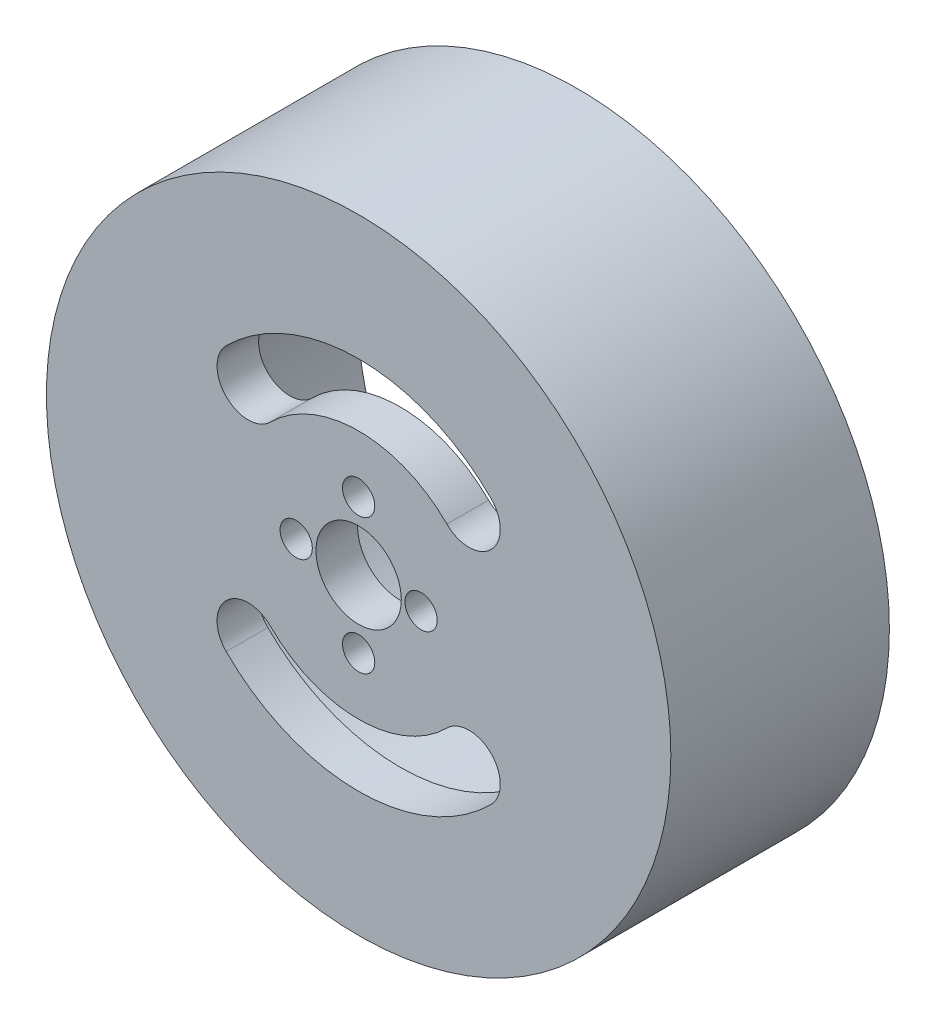
ISO-10303-21;
HEADER;
FILE_DESCRIPTION(('STEP AP214'),'2;1');
FILE_NAME('part.step','',(''),(''),'','','');
FILE_SCHEMA(('AUTOMOTIVE_DESIGN { 1 0 10303 214 1 1 1 1 }'));
ENDSEC;
DATA;
#1=APPLICATION_CONTEXT('core data for automotive mechanical design processes');
#2=APPLICATION_PROTOCOL_DEFINITION('international standard','automotive_design',2000,#1);
#3=PRODUCT_CONTEXT('',#1,'mechanical');
#4=PRODUCT('Part','Part','',(#3));
#5=PRODUCT_RELATED_PRODUCT_CATEGORY('part','',(#4));
#6=PRODUCT_DEFINITION_FORMATION('','',#4);
#7=PRODUCT_DEFINITION_CONTEXT('part definition',#1,'design');
#8=PRODUCT_DEFINITION('design','',#6,#7);
#9=PRODUCT_DEFINITION_SHAPE('','',#8);
#10=(LENGTH_UNIT() NAMED_UNIT(*) SI_UNIT(.MILLI.,.METRE.));
#11=(NAMED_UNIT(*) PLANE_ANGLE_UNIT() SI_UNIT($,.RADIAN.));
#12=(NAMED_UNIT(*) SI_UNIT($,.STERADIAN.) SOLID_ANGLE_UNIT());
#13=UNCERTAINTY_MEASURE_WITH_UNIT(LENGTH_MEASURE(1.E-05),#10,'distance_accuracy_value','');
#14=(GEOMETRIC_REPRESENTATION_CONTEXT(3) GLOBAL_UNCERTAINTY_ASSIGNED_CONTEXT((#13)) GLOBAL_UNIT_ASSIGNED_CONTEXT((#10,
#11,#12)) REPRESENTATION_CONTEXT('',''));
#15=CARTESIAN_POINT('',(0.,0.,0.));
#16=DIRECTION('',(0.,0.,1.));
#17=DIRECTION('',(1.,0.,0.));
#18=AXIS2_PLACEMENT_3D('',#15,#16,#17);
#19=CARTESIAN_POINT('',(0.,0.,-4.));
#20=DIRECTION('',(0.,0.,1.));
#21=DIRECTION('',(1.,0.,0.));
#22=AXIS2_PLACEMENT_3D('',#19,#20,#21);
#23=PLANE('',#22);
#24=CARTESIAN_POINT('',(0.,-6.5,-4.));
#25=DIRECTION('',(0.,0.,1.));
#26=DIRECTION('',(1.,0.,0.));
#27=AXIS2_PLACEMENT_3D('',#24,#25,#26);
#28=CIRCLE('',#27,1.55);
#29=CARTESIAN_POINT('',(1.55,-6.5,-4.));
#30=VERTEX_POINT('',#29);
#31=EDGE_CURVE('E177',#30,#30,#28,.T.);
#32=ORIENTED_EDGE('',*,*,#31,.T.);
#33=EDGE_LOOP('',(#32));
#34=FACE_BOUND('',#33,.T.);
#35=CARTESIAN_POINT('',(0.,0.,-4.));
#36=DIRECTION('',(0.,0.,-1.));
#37=DIRECTION('',(1.,0.,0.));
#38=AXIS2_PLACEMENT_3D('',#35,#36,#37);
#39=CIRCLE('',#38,12.);
#40=CARTESIAN_POINT('',(-8.48528137423847,8.48528137423867,-4.));
#41=VERTEX_POINT('',#40);
#42=CARTESIAN_POINT('',(8.48528137423846,8.48528137423867,-4.));
#43=VERTEX_POINT('',#42);
#44=EDGE_CURVE('E152',#41,#43,#39,.T.);
#45=ORIENTED_EDGE('',*,*,#44,.T.);
#46=CARTESIAN_POINT('',(10.6066017177981,10.6066017177983,-4.));
#47=DIRECTION('',(0.,0.,1.));
#48=DIRECTION('',(1.,0.,0.));
#49=AXIS2_PLACEMENT_3D('',#46,#47,#48);
#50=CIRCLE('',#49,3.);
#51=CARTESIAN_POINT('',(12.7279220613577,12.727922061358,-4.));
#52=VERTEX_POINT('',#51);
#53=EDGE_CURVE('E155',#43,#52,#50,.T.);
#54=ORIENTED_EDGE('',*,*,#53,.T.);
#55=CARTESIAN_POINT('',(0.,0.,-4.));
#56=DIRECTION('',(0.,0.,1.));
#57=DIRECTION('',(1.,0.,0.));
#58=AXIS2_PLACEMENT_3D('',#55,#56,#57);
#59=CIRCLE('',#58,18.);
#60=CARTESIAN_POINT('',(-12.7279220613577,12.727922061358,-4.));
#61=VERTEX_POINT('',#60);
#62=EDGE_CURVE('E145',#52,#61,#59,.T.);
#63=ORIENTED_EDGE('',*,*,#62,.T.);
#64=CARTESIAN_POINT('',(-10.6066017177981,10.6066017177983,-4.));
#65=DIRECTION('',(0.,0.,1.));
#66=DIRECTION('',(1.,0.,0.));
#67=AXIS2_PLACEMENT_3D('',#64,#65,#66);
#68=CIRCLE('',#67,3.);
#69=EDGE_CURVE('E148',#61,#41,#68,.T.);
#70=ORIENTED_EDGE('',*,*,#69,.T.);
#71=EDGE_LOOP('',(#45,#54,#63,#70));
#72=FACE_BOUND('',#71,.T.);
#73=CARTESIAN_POINT('',(6.,0.,-4.));
#74=DIRECTION('',(0.,0.,1.));
#75=DIRECTION('',(1.,0.,0.));
#76=AXIS2_PLACEMENT_3D('',#73,#74,#75);
#77=CIRCLE('',#76,1.55);
#78=CARTESIAN_POINT('',(7.55,0.,-4.));
#79=VERTEX_POINT('',#78);
#80=EDGE_CURVE('E139',#79,#79,#77,.T.);
#81=ORIENTED_EDGE('',*,*,#80,.T.);
#82=EDGE_LOOP('',(#81));
#83=FACE_BOUND('',#82,.T.);
#84=CARTESIAN_POINT('',(-10.6066017177981,-10.6066017177983,-4.));
#85=DIRECTION('',(0.,0.,1.));
#86=DIRECTION('',(1.,0.,0.));
#87=AXIS2_PLACEMENT_3D('',#84,#85,#86);
#88=CIRCLE('',#87,3.);
#89=CARTESIAN_POINT('',(-8.48528137423847,-8.48528137423867,-4.));
#90=VERTEX_POINT('',#89);
#91=CARTESIAN_POINT('',(-12.7279220613577,-12.727922061358,-4.));
#92=VERTEX_POINT('',#91);
#93=EDGE_CURVE('E110',#90,#92,#88,.T.);
#94=ORIENTED_EDGE('',*,*,#93,.T.);
#95=CARTESIAN_POINT('',(0.,0.,-4.));
#96=DIRECTION('',(0.,0.,1.));
#97=DIRECTION('',(1.,0.,0.));
#98=AXIS2_PLACEMENT_3D('',#95,#96,#97);
#99=CIRCLE('',#98,18.);
#100=CARTESIAN_POINT('',(12.7279220613577,-12.727922061358,-4.));
#101=VERTEX_POINT('',#100);
#102=EDGE_CURVE('E115',#92,#101,#99,.T.);
#103=ORIENTED_EDGE('',*,*,#102,.T.);
#104=CARTESIAN_POINT('',(10.6066017177981,-10.6066017177983,-4.));
#105=DIRECTION('',(0.,0.,1.));
#106=DIRECTION('',(1.,0.,0.));
#107=AXIS2_PLACEMENT_3D('',#104,#105,#106);
#108=CIRCLE('',#107,3.);
#109=CARTESIAN_POINT('',(8.48528137423847,-8.48528137423867,-4.));
#110=VERTEX_POINT('',#109);
#111=EDGE_CURVE('E120',#101,#110,#108,.T.);
#112=ORIENTED_EDGE('',*,*,#111,.T.);
#113=CARTESIAN_POINT('',(0.,0.,-4.));
#114=DIRECTION('',(0.,0.,-1.));
#115=DIRECTION('',(1.,0.,0.));
#116=AXIS2_PLACEMENT_3D('',#113,#114,#115);
#117=CIRCLE('',#116,12.);
#118=EDGE_CURVE('E50',#110,#90,#117,.T.);
#119=ORIENTED_EDGE('',*,*,#118,.T.);
#120=EDGE_LOOP('',(#94,#103,#112,#119));
#121=FACE_BOUND('',#120,.T.);
#122=CARTESIAN_POINT('',(-6.,0.,-4.));
#123=DIRECTION('',(0.,0.,1.));
#124=DIRECTION('',(1.,0.,0.));
#125=AXIS2_PLACEMENT_3D('',#122,#123,#124);
#126=CIRCLE('',#125,1.55);
#127=CARTESIAN_POINT('',(-4.45,0.,-4.));
#128=VERTEX_POINT('',#127);
#129=EDGE_CURVE('E129',#128,#128,#126,.T.);
#130=ORIENTED_EDGE('',*,*,#129,.T.);
#131=EDGE_LOOP('',(#130));
#132=FACE_BOUND('',#131,.T.);
#133=CARTESIAN_POINT('',(0.,6.5,-4.));
#134=DIRECTION('',(0.,0.,1.));
#135=DIRECTION('',(1.,0.,0.));
#136=AXIS2_PLACEMENT_3D('',#133,#134,#135);
#137=CIRCLE('',#136,1.55);
#138=CARTESIAN_POINT('',(1.55,6.5,-4.));
#139=VERTEX_POINT('',#138);
#140=EDGE_CURVE('E204',#139,#139,#137,.T.);
#141=ORIENTED_EDGE('',*,*,#140,.T.);
#142=EDGE_LOOP('',(#141));
#143=FACE_BOUND('',#142,.T.);
#144=CARTESIAN_POINT('',(0.,0.,-4.));
#145=DIRECTION('',(0.,0.,1.));
#146=DIRECTION('',(1.,0.,0.));
#147=AXIS2_PLACEMENT_3D('',#144,#145,#146);
#148=CIRCLE('',#147,4.1);
#149=CARTESIAN_POINT('',(4.1,0.,-4.));
#150=VERTEX_POINT('',#149);
#151=EDGE_CURVE('E196',#150,#150,#148,.T.);
#152=ORIENTED_EDGE('',*,*,#151,.T.);
#153=EDGE_LOOP('',(#152));
#154=FACE_BOUND('',#153,.T.);
#155=CARTESIAN_POINT('',(0.,0.,-4.));
#156=DIRECTION('',(0.,0.,1.));
#157=DIRECTION('',(1.,0.,0.));
#158=AXIS2_PLACEMENT_3D('',#155,#156,#157);
#159=CIRCLE('',#158,21.);
#160=CARTESIAN_POINT('',(21.,0.,-4.));
#161=VERTEX_POINT('',#160);
#162=EDGE_CURVE('E11',#161,#161,#159,.T.);
#163=ORIENTED_EDGE('',*,*,#162,.F.);
#164=EDGE_LOOP('',(#163));
#165=FACE_BOUND('',#164,.T.);
#166=ADVANCED_FACE('F35',(#34,#72,#83,#121,#132,#143,#154,#165),#23,.F.);
#167=CARTESIAN_POINT('',(0.,0.,-4.));
#168=DIRECTION('',(0.,0.,1.));
#169=DIRECTION('',(1.,0.,0.));
#170=AXIS2_PLACEMENT_3D('',#167,#168,#169);
#171=CYLINDRICAL_SURFACE('',#170,30.);
#172=CARTESIAN_POINT('',(0.,0.,0.));
#173=DIRECTION('',(0.,0.,1.));
#174=DIRECTION('',(1.,0.,0.));
#175=AXIS2_PLACEMENT_3D('',#172,#173,#174);
#176=CIRCLE('',#175,30.);
#177=CARTESIAN_POINT('',(30.,0.,0.));
#178=VERTEX_POINT('',#177);
#179=EDGE_CURVE('E43',#178,#178,#176,.T.);
#180=ORIENTED_EDGE('',*,*,#179,.F.);
#181=EDGE_LOOP('',(#180));
#182=FACE_BOUND('',#181,.T.);
#183=CARTESIAN_POINT('',(0.,0.,-21.));
#184=DIRECTION('',(0.,0.,-1.));
#185=DIRECTION('',(-1.,0.,0.));
#186=AXIS2_PLACEMENT_3D('',#183,#184,#185);
#187=CIRCLE('',#186,30.);
#188=CARTESIAN_POINT('',(-30.,0.,-21.));
#189=VERTEX_POINT('',#188);
#190=EDGE_CURVE('E190',#189,#189,#187,.T.);
#191=ORIENTED_EDGE('',*,*,#190,.F.);
#192=EDGE_LOOP('',(#191));
#193=FACE_BOUND('',#192,.T.);
#194=ADVANCED_FACE('F37',(#182,#193),#171,.T.);
#195=CARTESIAN_POINT('',(0.,0.,0.));
#196=DIRECTION('',(0.,0.,1.));
#197=DIRECTION('',(1.,0.,0.));
#198=AXIS2_PLACEMENT_3D('',#195,#196,#197);
#199=PLANE('',#198);
#200=CARTESIAN_POINT('',(0.,0.,0.));
#201=DIRECTION('',(0.,0.,1.));
#202=DIRECTION('',(1.,0.,0.));
#203=AXIS2_PLACEMENT_3D('',#200,#201,#202);
#204=CIRCLE('',#203,4.1);
#205=CARTESIAN_POINT('',(4.1,0.,0.));
#206=VERTEX_POINT('',#205);
#207=EDGE_CURVE('E192',#206,#206,#204,.T.);
#208=ORIENTED_EDGE('',*,*,#207,.F.);
#209=EDGE_LOOP('',(#208));
#210=FACE_BOUND('',#209,.T.);
#211=CARTESIAN_POINT('',(0.,6.5,0.));
#212=DIRECTION('',(0.,0.,1.));
#213=DIRECTION('',(1.,0.,0.));
#214=AXIS2_PLACEMENT_3D('',#211,#212,#213);
#215=CIRCLE('',#214,1.55);
#216=CARTESIAN_POINT('',(1.55,6.5,0.));
#217=VERTEX_POINT('',#216);
#218=EDGE_CURVE('E202',#217,#217,#215,.T.);
#219=ORIENTED_EDGE('',*,*,#218,.F.);
#220=EDGE_LOOP('',(#219));
#221=FACE_BOUND('',#220,.T.);
#222=CARTESIAN_POINT('',(-6.,0.,0.));
#223=DIRECTION('',(0.,0.,1.));
#224=DIRECTION('',(1.,0.,0.));
#225=AXIS2_PLACEMENT_3D('',#222,#223,#224);
#226=CIRCLE('',#225,1.55);
#227=CARTESIAN_POINT('',(-4.45,0.,0.));
#228=VERTEX_POINT('',#227);
#229=EDGE_CURVE('E207',#228,#228,#226,.T.);
#230=ORIENTED_EDGE('',*,*,#229,.F.);
#231=EDGE_LOOP('',(#230));
#232=FACE_BOUND('',#231,.T.);
#233=CARTESIAN_POINT('',(0.,0.,0.));
#234=DIRECTION('',(0.,0.,1.));
#235=DIRECTION('',(1.,0.,0.));
#236=AXIS2_PLACEMENT_3D('',#233,#234,#235);
#237=CIRCLE('',#236,18.);
#238=CARTESIAN_POINT('',(-12.7279220613577,-12.727922061358,0.));
#239=VERTEX_POINT('',#238);
#240=CARTESIAN_POINT('',(12.7279220613577,-12.727922061358,0.));
#241=VERTEX_POINT('',#240);
#242=EDGE_CURVE('E58',#239,#241,#237,.T.);
#243=ORIENTED_EDGE('',*,*,#242,.F.);
#244=CARTESIAN_POINT('',(-10.6066017177981,-10.6066017177983,0.));
#245=DIRECTION('',(0.,0.,1.));
#246=DIRECTION('',(1.,0.,0.));
#247=AXIS2_PLACEMENT_3D('',#244,#245,#246);
#248=CIRCLE('',#247,3.);
#249=CARTESIAN_POINT('',(-8.48528137423847,-8.48528137423867,0.));
#250=VERTEX_POINT('',#249);
#251=EDGE_CURVE('E131',#250,#239,#248,.T.);
#252=ORIENTED_EDGE('',*,*,#251,.F.);
#253=CARTESIAN_POINT('',(0.,0.,0.));
#254=DIRECTION('',(0.,0.,-1.));
#255=DIRECTION('',(1.,0.,0.));
#256=AXIS2_PLACEMENT_3D('',#253,#254,#255);
#257=CIRCLE('',#256,12.);
#258=CARTESIAN_POINT('',(8.48528137423847,-8.48528137423867,0.));
#259=VERTEX_POINT('',#258);
#260=EDGE_CURVE('E102',#259,#250,#257,.T.);
#261=ORIENTED_EDGE('',*,*,#260,.F.);
#262=CARTESIAN_POINT('',(10.6066017177981,-10.6066017177983,0.));
#263=DIRECTION('',(0.,0.,1.));
#264=DIRECTION('',(1.,0.,0.));
#265=AXIS2_PLACEMENT_3D('',#262,#263,#264);
#266=CIRCLE('',#265,2.99999999999999);
#267=EDGE_CURVE('E126',#241,#259,#266,.T.);
#268=ORIENTED_EDGE('',*,*,#267,.F.);
#269=EDGE_LOOP('',(#243,#252,#261,#268));
#270=FACE_BOUND('',#269,.T.);
#271=CARTESIAN_POINT('',(6.,0.,0.));
#272=DIRECTION('',(0.,0.,1.));
#273=DIRECTION('',(1.,0.,0.));
#274=AXIS2_PLACEMENT_3D('',#271,#272,#273);
#275=CIRCLE('',#274,1.55);
#276=CARTESIAN_POINT('',(7.55,0.,0.));
#277=VERTEX_POINT('',#276);
#278=EDGE_CURVE('E136',#277,#277,#275,.T.);
#279=ORIENTED_EDGE('',*,*,#278,.F.);
#280=EDGE_LOOP('',(#279));
#281=FACE_BOUND('',#280,.T.);
#282=CARTESIAN_POINT('',(10.6066017177981,10.6066017177983,0.));
#283=DIRECTION('',(0.,0.,1.));
#284=DIRECTION('',(1.,0.,0.));
#285=AXIS2_PLACEMENT_3D('',#282,#283,#284);
#286=CIRCLE('',#285,3.);
#287=CARTESIAN_POINT('',(8.48528137423846,8.48528137423867,0.));
#288=VERTEX_POINT('',#287);
#289=CARTESIAN_POINT('',(12.7279220613577,12.727922061358,0.));
#290=VERTEX_POINT('',#289);
#291=EDGE_CURVE('E149',#288,#290,#286,.T.);
#292=ORIENTED_EDGE('',*,*,#291,.F.);
#293=CARTESIAN_POINT('',(0.,0.,0.));
#294=DIRECTION('',(0.,0.,-1.));
#295=DIRECTION('',(1.,0.,0.));
#296=AXIS2_PLACEMENT_3D('',#293,#294,#295);
#297=CIRCLE('',#296,12.);
#298=CARTESIAN_POINT('',(-8.48528137423847,8.48528137423867,0.));
#299=VERTEX_POINT('',#298);
#300=EDGE_CURVE('E164',#299,#288,#297,.T.);
#301=ORIENTED_EDGE('',*,*,#300,.F.);
#302=CARTESIAN_POINT('',(-10.6066017177981,10.6066017177983,0.));
#303=DIRECTION('',(0.,0.,1.));
#304=DIRECTION('',(1.,0.,0.));
#305=AXIS2_PLACEMENT_3D('',#302,#303,#304);
#306=CIRCLE('',#305,3.);
#307=CARTESIAN_POINT('',(-12.7279220613577,12.727922061358,0.));
#308=VERTEX_POINT('',#307);
#309=EDGE_CURVE('E161',#308,#299,#306,.T.);
#310=ORIENTED_EDGE('',*,*,#309,.F.);
#311=CARTESIAN_POINT('',(0.,0.,0.));
#312=DIRECTION('',(0.,0.,1.));
#313=DIRECTION('',(1.,0.,0.));
#314=AXIS2_PLACEMENT_3D('',#311,#312,#313);
#315=CIRCLE('',#314,18.);
#316=EDGE_CURVE('E142',#290,#308,#315,.T.);
#317=ORIENTED_EDGE('',*,*,#316,.F.);
#318=EDGE_LOOP('',(#292,#301,#310,#317));
#319=FACE_BOUND('',#318,.T.);
#320=CARTESIAN_POINT('',(0.,-6.5,0.));
#321=DIRECTION('',(0.,0.,1.));
#322=DIRECTION('',(1.,0.,0.));
#323=AXIS2_PLACEMENT_3D('',#320,#321,#322);
#324=CIRCLE('',#323,1.55);
#325=CARTESIAN_POINT('',(1.55,-6.5,0.));
#326=VERTEX_POINT('',#325);
#327=EDGE_CURVE('E171',#326,#326,#324,.T.);
#328=ORIENTED_EDGE('',*,*,#327,.F.);
#329=EDGE_LOOP('',(#328));
#330=FACE_BOUND('',#329,.T.);
#331=ORIENTED_EDGE('',*,*,#179,.T.);
#332=EDGE_LOOP('',(#331));
#333=FACE_BOUND('',#332,.T.);
#334=ADVANCED_FACE('F184',(#210,#221,#232,#270,#281,#319,#330,#333),#199,.T.);
#335=CARTESIAN_POINT('',(0.,-6.5,-4.));
#336=DIRECTION('',(0.,0.,1.));
#337=DIRECTION('',(1.,0.,0.));
#338=AXIS2_PLACEMENT_3D('',#335,#336,#337);
#339=CYLINDRICAL_SURFACE('',#338,1.55);
#340=ORIENTED_EDGE('',*,*,#327,.T.);
#341=EDGE_LOOP('',(#340));
#342=FACE_BOUND('',#341,.T.);
#343=ORIENTED_EDGE('',*,*,#31,.F.);
#344=EDGE_LOOP('',(#343));
#345=FACE_BOUND('',#344,.T.);
#346=ADVANCED_FACE('F219',(#342,#345),#339,.F.);
#347=CARTESIAN_POINT('',(10.6066017177981,10.6066017177983,-4.));
#348=DIRECTION('',(0.,0.,1.));
#349=DIRECTION('',(1.,0.,0.));
#350=AXIS2_PLACEMENT_3D('',#347,#348,#349);
#351=CYLINDRICAL_SURFACE('',#350,3.);
#352=ORIENTED_EDGE('',*,*,#291,.T.);
#353=DIRECTION('',(0.,0.,1.));
#354=VECTOR('',#353,1.);
#355=CARTESIAN_POINT('',(12.7279220613577,12.727922061358,-4.));
#356=LINE('',#355,#354);
#357=EDGE_CURVE('E168',#52,#290,#356,.T.);
#358=ORIENTED_EDGE('',*,*,#357,.F.);
#359=ORIENTED_EDGE('',*,*,#53,.F.);
#360=DIRECTION('',(0.,0.,1.));
#361=VECTOR('',#360,1.);
#362=CARTESIAN_POINT('',(8.48528137423846,8.48528137423867,-4.));
#363=LINE('',#362,#361);
#364=EDGE_CURVE('E172',#43,#288,#363,.T.);
#365=ORIENTED_EDGE('',*,*,#364,.T.);
#366=EDGE_LOOP('',(#352,#358,#359,#365));
#367=FACE_BOUND('',#366,.T.);
#368=ADVANCED_FACE('F233',(#367),#351,.F.);
#369=CARTESIAN_POINT('',(0.,0.,-4.));
#370=DIRECTION('',(0.,0.,1.));
#371=DIRECTION('',(1.,0.,0.));
#372=AXIS2_PLACEMENT_3D('',#369,#370,#371);
#373=CYLINDRICAL_SURFACE('',#372,12.);
#374=ORIENTED_EDGE('',*,*,#300,.T.);
#375=ORIENTED_EDGE('',*,*,#364,.F.);
#376=ORIENTED_EDGE('',*,*,#44,.F.);
#377=DIRECTION('',(0.,0.,1.));
#378=VECTOR('',#377,1.);
#379=CARTESIAN_POINT('',(-8.48528137423847,8.48528137423867,-4.));
#380=LINE('',#379,#378);
#381=EDGE_CURVE('E174',#41,#299,#380,.T.);
#382=ORIENTED_EDGE('',*,*,#381,.T.);
#383=EDGE_LOOP('',(#374,#375,#376,#382));
#384=FACE_BOUND('',#383,.T.);
#385=ADVANCED_FACE('F264',(#384),#373,.T.);
#386=CARTESIAN_POINT('',(-10.6066017177981,10.6066017177983,-4.));
#387=DIRECTION('',(0.,0.,1.));
#388=DIRECTION('',(1.,0.,0.));
#389=AXIS2_PLACEMENT_3D('',#386,#387,#388);
#390=CYLINDRICAL_SURFACE('',#389,3.);
#391=ORIENTED_EDGE('',*,*,#309,.T.);
#392=ORIENTED_EDGE('',*,*,#381,.F.);
#393=ORIENTED_EDGE('',*,*,#69,.F.);
#394=DIRECTION('',(0.,0.,1.));
#395=VECTOR('',#394,1.);
#396=CARTESIAN_POINT('',(-12.7279220613577,12.727922061358,-4.));
#397=LINE('',#396,#395);
#398=EDGE_CURVE('E158',#61,#308,#397,.T.);
#399=ORIENTED_EDGE('',*,*,#398,.T.);
#400=EDGE_LOOP('',(#391,#392,#393,#399));
#401=FACE_BOUND('',#400,.T.);
#402=ADVANCED_FACE('F255',(#401),#390,.F.);
#403=CARTESIAN_POINT('',(0.,0.,-4.));
#404=DIRECTION('',(0.,0.,1.));
#405=DIRECTION('',(1.,0.,0.));
#406=AXIS2_PLACEMENT_3D('',#403,#404,#405);
#407=CYLINDRICAL_SURFACE('',#406,18.);
#408=ORIENTED_EDGE('',*,*,#316,.T.);
#409=ORIENTED_EDGE('',*,*,#398,.F.);
#410=ORIENTED_EDGE('',*,*,#62,.F.);
#411=ORIENTED_EDGE('',*,*,#357,.T.);
#412=EDGE_LOOP('',(#408,#409,#410,#411));
#413=FACE_BOUND('',#412,.T.);
#414=ADVANCED_FACE('F247',(#413),#407,.F.);
#415=CARTESIAN_POINT('',(6.,0.,-4.));
#416=DIRECTION('',(0.,0.,1.));
#417=DIRECTION('',(1.,0.,0.));
#418=AXIS2_PLACEMENT_3D('',#415,#416,#417);
#419=CYLINDRICAL_SURFACE('',#418,1.55);
#420=ORIENTED_EDGE('',*,*,#278,.T.);
#421=EDGE_LOOP('',(#420));
#422=FACE_BOUND('',#421,.T.);
#423=ORIENTED_EDGE('',*,*,#80,.F.);
#424=EDGE_LOOP('',(#423));
#425=FACE_BOUND('',#424,.T.);
#426=ADVANCED_FACE('F244',(#422,#425),#419,.F.);
#427=CARTESIAN_POINT('',(0.,0.,-4.));
#428=DIRECTION('',(0.,0.,1.));
#429=DIRECTION('',(1.,0.,0.));
#430=AXIS2_PLACEMENT_3D('',#427,#428,#429);
#431=CYLINDRICAL_SURFACE('',#430,18.);
#432=ORIENTED_EDGE('',*,*,#242,.T.);
#433=DIRECTION('',(0.,0.,1.));
#434=VECTOR('',#433,1.);
#435=CARTESIAN_POINT('',(12.7279220613577,-12.727922061358,-4.));
#436=LINE('',#435,#434);
#437=EDGE_CURVE('E134',#101,#241,#436,.T.);
#438=ORIENTED_EDGE('',*,*,#437,.F.);
#439=ORIENTED_EDGE('',*,*,#102,.F.);
#440=DIRECTION('',(0.,0.,1.));
#441=VECTOR('',#440,1.);
#442=CARTESIAN_POINT('',(-12.7279220613577,-12.727922061358,-4.));
#443=LINE('',#442,#441);
#444=EDGE_CURVE('E106',#92,#239,#443,.T.);
#445=ORIENTED_EDGE('',*,*,#444,.T.);
#446=EDGE_LOOP('',(#432,#438,#439,#445));
#447=FACE_BOUND('',#446,.T.);
#448=ADVANCED_FACE('F246',(#447),#431,.F.);
#449=CARTESIAN_POINT('',(-10.6066017177981,-10.6066017177983,-4.));
#450=DIRECTION('',(0.,0.,1.));
#451=DIRECTION('',(1.,0.,0.));
#452=AXIS2_PLACEMENT_3D('',#449,#450,#451);
#453=CYLINDRICAL_SURFACE('',#452,3.);
#454=ORIENTED_EDGE('',*,*,#251,.T.);
#455=ORIENTED_EDGE('',*,*,#444,.F.);
#456=ORIENTED_EDGE('',*,*,#93,.F.);
#457=DIRECTION('',(0.,0.,1.));
#458=VECTOR('',#457,1.);
#459=CARTESIAN_POINT('',(-8.48528137423847,-8.48528137423867,-4.));
#460=LINE('',#459,#458);
#461=EDGE_CURVE('E98',#90,#250,#460,.T.);
#462=ORIENTED_EDGE('',*,*,#461,.T.);
#463=EDGE_LOOP('',(#454,#455,#456,#462));
#464=FACE_BOUND('',#463,.T.);
#465=ADVANCED_FACE('F111',(#464),#453,.F.);
#466=CARTESIAN_POINT('',(0.,0.,-4.));
#467=DIRECTION('',(0.,0.,1.));
#468=DIRECTION('',(1.,0.,0.));
#469=AXIS2_PLACEMENT_3D('',#466,#467,#468);
#470=CYLINDRICAL_SURFACE('',#469,12.);
#471=ORIENTED_EDGE('',*,*,#260,.T.);
#472=ORIENTED_EDGE('',*,*,#461,.F.);
#473=ORIENTED_EDGE('',*,*,#118,.F.);
#474=DIRECTION('',(0.,0.,1.));
#475=VECTOR('',#474,1.);
#476=CARTESIAN_POINT('',(8.48528137423847,-8.48528137423867,-4.));
#477=LINE('',#476,#475);
#478=EDGE_CURVE('E107',#110,#259,#477,.T.);
#479=ORIENTED_EDGE('',*,*,#478,.T.);
#480=EDGE_LOOP('',(#471,#472,#473,#479));
#481=FACE_BOUND('',#480,.T.);
#482=ADVANCED_FACE('F100',(#481),#470,.T.);
#483=CARTESIAN_POINT('',(10.6066017177981,-10.6066017177983,-4.));
#484=DIRECTION('',(0.,0.,1.));
#485=DIRECTION('',(1.,0.,0.));
#486=AXIS2_PLACEMENT_3D('',#483,#484,#485);
#487=CYLINDRICAL_SURFACE('',#486,2.99999999999999);
#488=ORIENTED_EDGE('',*,*,#267,.T.);
#489=ORIENTED_EDGE('',*,*,#478,.F.);
#490=ORIENTED_EDGE('',*,*,#111,.F.);
#491=ORIENTED_EDGE('',*,*,#437,.T.);
#492=EDGE_LOOP('',(#488,#489,#490,#491));
#493=FACE_BOUND('',#492,.T.);
#494=ADVANCED_FACE('F260',(#493),#487,.F.);
#495=CARTESIAN_POINT('',(-6.,0.,-4.));
#496=DIRECTION('',(0.,0.,1.));
#497=DIRECTION('',(1.,0.,0.));
#498=AXIS2_PLACEMENT_3D('',#495,#496,#497);
#499=CYLINDRICAL_SURFACE('',#498,1.55);
#500=ORIENTED_EDGE('',*,*,#229,.T.);
#501=EDGE_LOOP('',(#500));
#502=FACE_BOUND('',#501,.T.);
#503=ORIENTED_EDGE('',*,*,#129,.F.);
#504=EDGE_LOOP('',(#503));
#505=FACE_BOUND('',#504,.T.);
#506=ADVANCED_FACE('F214',(#502,#505),#499,.F.);
#507=CARTESIAN_POINT('',(0.,6.5,-4.));
#508=DIRECTION('',(0.,0.,1.));
#509=DIRECTION('',(1.,0.,0.));
#510=AXIS2_PLACEMENT_3D('',#507,#508,#509);
#511=CYLINDRICAL_SURFACE('',#510,1.55);
#512=ORIENTED_EDGE('',*,*,#218,.T.);
#513=EDGE_LOOP('',(#512));
#514=FACE_BOUND('',#513,.T.);
#515=ORIENTED_EDGE('',*,*,#140,.F.);
#516=EDGE_LOOP('',(#515));
#517=FACE_BOUND('',#516,.T.);
#518=ADVANCED_FACE('F330',(#514,#517),#511,.F.);
#519=CARTESIAN_POINT('',(0.,0.,-4.));
#520=DIRECTION('',(0.,0.,1.));
#521=DIRECTION('',(1.,0.,0.));
#522=AXIS2_PLACEMENT_3D('',#519,#520,#521);
#523=CYLINDRICAL_SURFACE('',#522,4.1);
#524=ORIENTED_EDGE('',*,*,#207,.T.);
#525=EDGE_LOOP('',(#524));
#526=FACE_BOUND('',#525,.T.);
#527=ORIENTED_EDGE('',*,*,#151,.F.);
#528=EDGE_LOOP('',(#527));
#529=FACE_BOUND('',#528,.T.);
#530=ADVANCED_FACE('F340',(#526,#529),#523,.F.);
#531=CARTESIAN_POINT('',(0.,0.,-21.));
#532=DIRECTION('',(0.,0.,-1.));
#533=DIRECTION('',(-1.,0.,0.));
#534=AXIS2_PLACEMENT_3D('',#531,#532,#533);
#535=PLANE('',#534);
#536=CARTESIAN_POINT('',(0.,0.,-21.));
#537=DIRECTION('',(0.,0.,-1.));
#538=DIRECTION('',(-1.,0.,0.));
#539=AXIS2_PLACEMENT_3D('',#536,#537,#538);
#540=CIRCLE('',#539,21.);
#541=CARTESIAN_POINT('',(-21.,0.,-21.));
#542=VERTEX_POINT('',#541);
#543=EDGE_CURVE('E193',#542,#542,#540,.T.);
#544=ORIENTED_EDGE('',*,*,#543,.F.);
#545=EDGE_LOOP('',(#544));
#546=FACE_BOUND('',#545,.T.);
#547=ORIENTED_EDGE('',*,*,#190,.T.);
#548=EDGE_LOOP('',(#547));
#549=FACE_BOUND('',#548,.T.);
#550=ADVANCED_FACE('F351',(#546,#549),#535,.T.);
#551=CARTESIAN_POINT('',(0.,0.,-4.));
#552=DIRECTION('',(0.,0.,-1.));
#553=DIRECTION('',(-1.,0.,0.));
#554=AXIS2_PLACEMENT_3D('',#551,#552,#553);
#555=CYLINDRICAL_SURFACE('',#554,21.);
#556=ORIENTED_EDGE('',*,*,#543,.T.);
#557=EDGE_LOOP('',(#556));
#558=FACE_BOUND('',#557,.T.);
#559=ORIENTED_EDGE('',*,*,#162,.T.);
#560=EDGE_LOOP('',(#559));
#561=FACE_BOUND('',#560,.T.);
#562=ADVANCED_FACE('F374',(#558,#561),#555,.F.);
#563=CLOSED_SHELL('',(#166,#194,#334,#346,#368,#385,#402,#414,#426,#448,#465,#482,#494,#506,
#518,#530,#550,#562));
#564=MANIFOLD_SOLID_BREP('B2',#563);
#565=ADVANCED_BREP_SHAPE_REPRESENTATION('',(#18,#564),#14);
#566=SHAPE_DEFINITION_REPRESENTATION(#9,#565);
ENDSEC;
END-ISO-10303-21;
